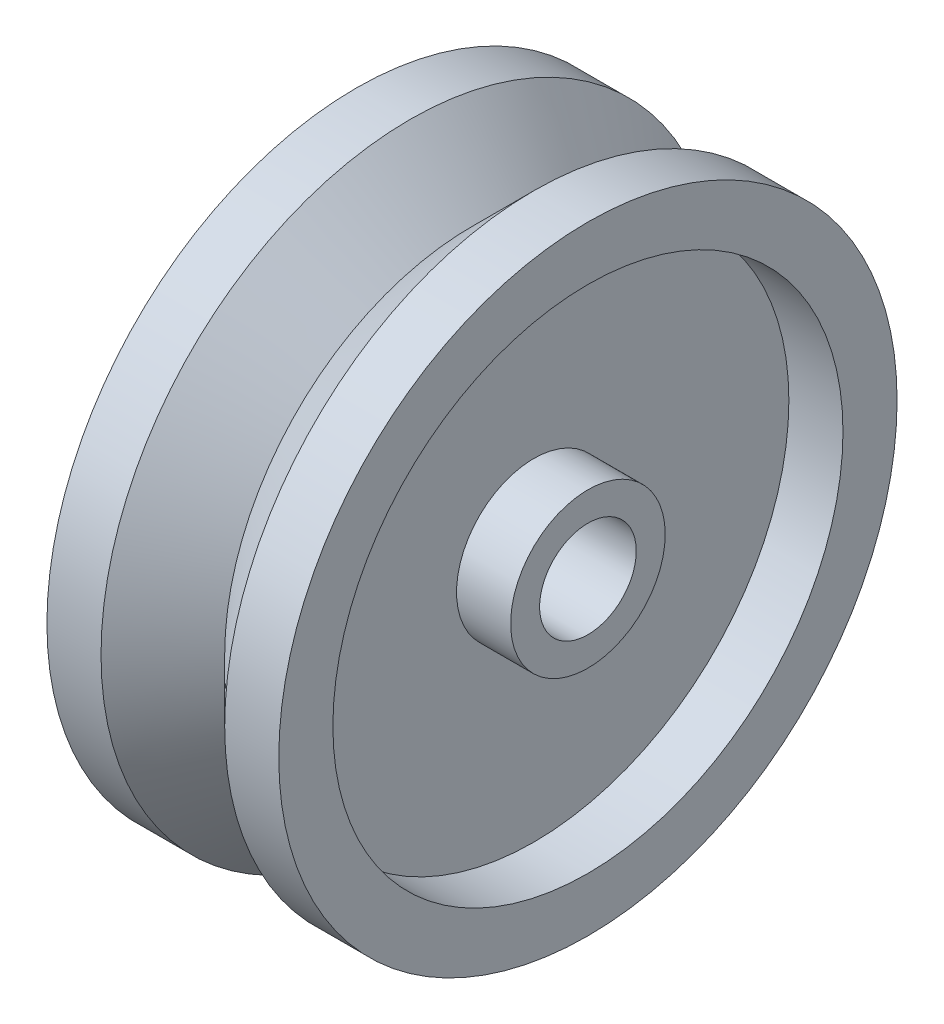
ISO-10303-21;
HEADER;
FILE_DESCRIPTION(('STEP AP214'),'2;1');
FILE_NAME('part.step','',(''),(''),'','','');
FILE_SCHEMA(('AUTOMOTIVE_DESIGN { 1 0 10303 214 1 1 1 1 }'));
ENDSEC;
DATA;
#1=APPLICATION_CONTEXT('core data for automotive mechanical design processes');
#2=APPLICATION_PROTOCOL_DEFINITION('international standard','automotive_design',2000,#1);
#3=PRODUCT_CONTEXT('',#1,'mechanical');
#4=PRODUCT('Part','Part','',(#3));
#5=PRODUCT_RELATED_PRODUCT_CATEGORY('part','',(#4));
#6=PRODUCT_DEFINITION_FORMATION('','',#4);
#7=PRODUCT_DEFINITION_CONTEXT('part definition',#1,'design');
#8=PRODUCT_DEFINITION('design','',#6,#7);
#9=PRODUCT_DEFINITION_SHAPE('','',#8);
#10=(LENGTH_UNIT() NAMED_UNIT(*) SI_UNIT(.MILLI.,.METRE.));
#11=(NAMED_UNIT(*) PLANE_ANGLE_UNIT() SI_UNIT($,.RADIAN.));
#12=(NAMED_UNIT(*) SI_UNIT($,.STERADIAN.) SOLID_ANGLE_UNIT());
#13=UNCERTAINTY_MEASURE_WITH_UNIT(LENGTH_MEASURE(1.E-05),#10,'distance_accuracy_value','');
#14=(GEOMETRIC_REPRESENTATION_CONTEXT(3) GLOBAL_UNCERTAINTY_ASSIGNED_CONTEXT((#13)) GLOBAL_UNIT_ASSIGNED_CONTEXT((#10,
#11,#12)) REPRESENTATION_CONTEXT('',''));
#15=CARTESIAN_POINT('',(0.,0.,0.));
#16=DIRECTION('',(0.,0.,1.));
#17=DIRECTION('',(1.,0.,0.));
#18=AXIS2_PLACEMENT_3D('',#15,#16,#17);
#19=CARTESIAN_POINT('',(15.,0.,0.));
#20=DIRECTION('',(-1.,0.,0.));
#21=DIRECTION('',(0.,0.,1.));
#22=AXIS2_PLACEMENT_3D('',#19,#20,#21);
#23=CYLINDRICAL_SURFACE('',#22,20.);
#24=CARTESIAN_POINT('',(0.,0.,0.));
#25=DIRECTION('',(1.,0.,0.));
#26=DIRECTION('',(0.,0.,-1.));
#27=AXIS2_PLACEMENT_3D('',#24,#25,#26);
#28=CIRCLE('',#27,20.);
#29=CARTESIAN_POINT('',(0.,0.,-20.));
#30=VERTEX_POINT('',#29);
#31=EDGE_CURVE('E34',#30,#30,#28,.T.);
#32=ORIENTED_EDGE('',*,*,#31,.T.);
#33=EDGE_LOOP('',(#32));
#34=FACE_BOUND('',#33,.T.);
#35=CARTESIAN_POINT('',(3.5,0.,0.));
#36=DIRECTION('',(-1.,0.,0.));
#37=DIRECTION('',(0.,0.,1.));
#38=AXIS2_PLACEMENT_3D('',#35,#36,#37);
#39=CIRCLE('',#38,20.);
#40=CARTESIAN_POINT('',(3.5,0.,20.));
#41=VERTEX_POINT('',#40);
#42=EDGE_CURVE('E70',#41,#41,#39,.T.);
#43=ORIENTED_EDGE('',*,*,#42,.T.);
#44=EDGE_LOOP('',(#43));
#45=FACE_BOUND('',#44,.T.);
#46=ADVANCED_FACE('F31',(#34,#45),#23,.T.);
#47=CARTESIAN_POINT('',(15.,0.,0.));
#48=DIRECTION('',(1.,0.,0.));
#49=DIRECTION('',(0.,0.,-1.));
#50=AXIS2_PLACEMENT_3D('',#47,#48,#49);
#51=CIRCLE('',#50,20.);
#52=CARTESIAN_POINT('',(15.,0.,-20.));
#53=VERTEX_POINT('',#52);
#54=EDGE_CURVE('E10',#53,#53,#51,.T.);
#55=ORIENTED_EDGE('',*,*,#54,.F.);
#56=EDGE_LOOP('',(#55));
#57=FACE_BOUND('',#56,.T.);
#58=CARTESIAN_POINT('',(11.5,0.,0.));
#59=DIRECTION('',(-1.,0.,0.));
#60=DIRECTION('',(0.,0.,1.));
#61=AXIS2_PLACEMENT_3D('',#58,#59,#60);
#62=CIRCLE('',#61,20.);
#63=CARTESIAN_POINT('',(11.5,0.,20.));
#64=VERTEX_POINT('',#63);
#65=EDGE_CURVE('E78',#64,#64,#62,.T.);
#66=ORIENTED_EDGE('',*,*,#65,.F.);
#67=EDGE_LOOP('',(#66));
#68=FACE_BOUND('',#67,.T.);
#69=ADVANCED_FACE('F85',(#57,#68),#23,.T.);
#70=CARTESIAN_POINT('',(15.,0.,0.));
#71=DIRECTION('',(1.,0.,0.));
#72=DIRECTION('',(0.,0.,-1.));
#73=AXIS2_PLACEMENT_3D('',#70,#71,#72);
#74=PLANE('',#73);
#75=CARTESIAN_POINT('',(15.,0.,0.));
#76=DIRECTION('',(1.,0.,0.));
#77=DIRECTION('',(0.,0.,-1.));
#78=AXIS2_PLACEMENT_3D('',#75,#76,#77);
#79=CIRCLE('',#78,16.5);
#80=CARTESIAN_POINT('',(15.,0.,-16.5));
#81=VERTEX_POINT('',#80);
#82=EDGE_CURVE('E43',#81,#81,#79,.T.);
#83=ORIENTED_EDGE('',*,*,#82,.F.);
#84=EDGE_LOOP('',(#83));
#85=FACE_BOUND('',#84,.T.);
#86=ORIENTED_EDGE('',*,*,#54,.T.);
#87=EDGE_LOOP('',(#86));
#88=FACE_BOUND('',#87,.T.);
#89=ADVANCED_FACE('F87',(#85,#88),#74,.T.);
#90=CARTESIAN_POINT('',(0.,0.,0.));
#91=DIRECTION('',(1.,0.,0.));
#92=DIRECTION('',(0.,0.,-1.));
#93=AXIS2_PLACEMENT_3D('',#90,#91,#92);
#94=PLANE('',#93);
#95=CARTESIAN_POINT('',(0.,0.,0.));
#96=DIRECTION('',(-1.,0.,0.));
#97=DIRECTION('',(0.,0.,1.));
#98=AXIS2_PLACEMENT_3D('',#95,#96,#97);
#99=CIRCLE('',#98,16.5);
#100=CARTESIAN_POINT('',(0.,0.,16.5));
#101=VERTEX_POINT('',#100);
#102=EDGE_CURVE('E55',#101,#101,#99,.T.);
#103=ORIENTED_EDGE('',*,*,#102,.F.);
#104=EDGE_LOOP('',(#103));
#105=FACE_BOUND('',#104,.T.);
#106=ORIENTED_EDGE('',*,*,#31,.F.);
#107=EDGE_LOOP('',(#106));
#108=FACE_BOUND('',#107,.T.);
#109=ADVANCED_FACE('F93',(#105,#108),#94,.F.);
#110=CARTESIAN_POINT('',(11.5,0.,0.));
#111=DIRECTION('',(1.,0.,0.));
#112=DIRECTION('',(0.,0.,-1.));
#113=AXIS2_PLACEMENT_3D('',#110,#111,#112);
#114=CYLINDRICAL_SURFACE('',#113,16.5);
#115=CARTESIAN_POINT('',(11.5,0.,0.));
#116=DIRECTION('',(1.,0.,0.));
#117=DIRECTION('',(0.,0.,-1.));
#118=AXIS2_PLACEMENT_3D('',#115,#116,#117);
#119=CIRCLE('',#118,16.5);
#120=CARTESIAN_POINT('',(11.5,0.,-16.5));
#121=VERTEX_POINT('',#120);
#122=EDGE_CURVE('E41',#121,#121,#119,.T.);
#123=ORIENTED_EDGE('',*,*,#122,.F.);
#124=EDGE_LOOP('',(#123));
#125=FACE_BOUND('',#124,.T.);
#126=ORIENTED_EDGE('',*,*,#82,.T.);
#127=EDGE_LOOP('',(#126));
#128=FACE_BOUND('',#127,.T.);
#129=ADVANCED_FACE('F137',(#125,#128),#114,.F.);
#130=CARTESIAN_POINT('',(11.5,0.,0.));
#131=DIRECTION('',(1.,0.,0.));
#132=DIRECTION('',(0.,0.,-1.));
#133=AXIS2_PLACEMENT_3D('',#130,#131,#132);
#134=PLANE('',#133);
#135=CARTESIAN_POINT('',(11.5,0.,0.));
#136=DIRECTION('',(1.,0.,0.));
#137=DIRECTION('',(0.,0.,-1.));
#138=AXIS2_PLACEMENT_3D('',#135,#136,#137);
#139=CIRCLE('',#138,5.);
#140=CARTESIAN_POINT('',(11.5,0.,-5.));
#141=VERTEX_POINT('',#140);
#142=EDGE_CURVE('E46',#141,#141,#139,.T.);
#143=ORIENTED_EDGE('',*,*,#142,.F.);
#144=EDGE_LOOP('',(#143));
#145=FACE_BOUND('',#144,.T.);
#146=ORIENTED_EDGE('',*,*,#122,.T.);
#147=EDGE_LOOP('',(#146));
#148=FACE_BOUND('',#147,.T.);
#149=ADVANCED_FACE('F133',(#145,#148),#134,.T.);
#150=CARTESIAN_POINT('',(11.5,0.,0.));
#151=DIRECTION('',(1.,0.,0.));
#152=DIRECTION('',(0.,0.,-1.));
#153=AXIS2_PLACEMENT_3D('',#150,#151,#152);
#154=CYLINDRICAL_SURFACE('',#153,5.);
#155=ORIENTED_EDGE('',*,*,#142,.T.);
#156=EDGE_LOOP('',(#155));
#157=FACE_BOUND('',#156,.T.);
#158=CARTESIAN_POINT('',(15.,0.,0.));
#159=DIRECTION('',(1.,0.,0.));
#160=DIRECTION('',(0.,0.,-1.));
#161=AXIS2_PLACEMENT_3D('',#158,#159,#160);
#162=CIRCLE('',#161,5.);
#163=CARTESIAN_POINT('',(15.,0.,-5.));
#164=VERTEX_POINT('',#163);
#165=EDGE_CURVE('E49',#164,#164,#162,.T.);
#166=ORIENTED_EDGE('',*,*,#165,.F.);
#167=EDGE_LOOP('',(#166));
#168=FACE_BOUND('',#167,.T.);
#169=ADVANCED_FACE('F130',(#157,#168),#154,.T.);
#170=CARTESIAN_POINT('',(15.,0.,0.));
#171=DIRECTION('',(1.,0.,0.));
#172=DIRECTION('',(0.,0.,-1.));
#173=AXIS2_PLACEMENT_3D('',#170,#171,#172);
#174=CIRCLE('',#173,3.125);
#175=CARTESIAN_POINT('',(15.,0.,-3.125));
#176=VERTEX_POINT('',#175);
#177=EDGE_CURVE('E67',#176,#176,#174,.T.);
#178=ORIENTED_EDGE('',*,*,#177,.F.);
#179=EDGE_LOOP('',(#178));
#180=FACE_BOUND('',#179,.T.);
#181=ORIENTED_EDGE('',*,*,#165,.T.);
#182=EDGE_LOOP('',(#181));
#183=FACE_BOUND('',#182,.T.);
#184=ADVANCED_FACE('F96',(#180,#183),#74,.T.);
#185=CARTESIAN_POINT('',(3.5,0.,0.));
#186=DIRECTION('',(-1.,0.,0.));
#187=DIRECTION('',(0.,0.,1.));
#188=AXIS2_PLACEMENT_3D('',#185,#186,#187);
#189=CYLINDRICAL_SURFACE('',#188,16.5);
#190=CARTESIAN_POINT('',(3.5,0.,0.));
#191=DIRECTION('',(-1.,0.,0.));
#192=DIRECTION('',(0.,0.,1.));
#193=AXIS2_PLACEMENT_3D('',#190,#191,#192);
#194=CIRCLE('',#193,16.5);
#195=CARTESIAN_POINT('',(3.5,0.,16.5));
#196=VERTEX_POINT('',#195);
#197=EDGE_CURVE('E52',#196,#196,#194,.T.);
#198=ORIENTED_EDGE('',*,*,#197,.F.);
#199=EDGE_LOOP('',(#198));
#200=FACE_BOUND('',#199,.T.);
#201=ORIENTED_EDGE('',*,*,#102,.T.);
#202=EDGE_LOOP('',(#201));
#203=FACE_BOUND('',#202,.T.);
#204=ADVANCED_FACE('F125',(#200,#203),#189,.F.);
#205=CARTESIAN_POINT('',(3.5,0.,0.));
#206=DIRECTION('',(-1.,0.,0.));
#207=DIRECTION('',(0.,0.,1.));
#208=AXIS2_PLACEMENT_3D('',#205,#206,#207);
#209=PLANE('',#208);
#210=CARTESIAN_POINT('',(3.5,0.,0.));
#211=DIRECTION('',(-1.,0.,0.));
#212=DIRECTION('',(0.,0.,1.));
#213=AXIS2_PLACEMENT_3D('',#210,#211,#212);
#214=CIRCLE('',#213,5.);
#215=CARTESIAN_POINT('',(3.5,0.,5.));
#216=VERTEX_POINT('',#215);
#217=EDGE_CURVE('E58',#216,#216,#214,.T.);
#218=ORIENTED_EDGE('',*,*,#217,.F.);
#219=EDGE_LOOP('',(#218));
#220=FACE_BOUND('',#219,.T.);
#221=ORIENTED_EDGE('',*,*,#197,.T.);
#222=EDGE_LOOP('',(#221));
#223=FACE_BOUND('',#222,.T.);
#224=ADVANCED_FACE('F121',(#220,#223),#209,.T.);
#225=CARTESIAN_POINT('',(3.5,0.,0.));
#226=DIRECTION('',(-1.,0.,0.));
#227=DIRECTION('',(0.,0.,1.));
#228=AXIS2_PLACEMENT_3D('',#225,#226,#227);
#229=CYLINDRICAL_SURFACE('',#228,5.);
#230=ORIENTED_EDGE('',*,*,#217,.T.);
#231=EDGE_LOOP('',(#230));
#232=FACE_BOUND('',#231,.T.);
#233=CARTESIAN_POINT('',(0.,0.,0.));
#234=DIRECTION('',(-1.,0.,0.));
#235=DIRECTION('',(0.,0.,1.));
#236=AXIS2_PLACEMENT_3D('',#233,#234,#235);
#237=CIRCLE('',#236,5.);
#238=CARTESIAN_POINT('',(0.,0.,5.));
#239=VERTEX_POINT('',#238);
#240=EDGE_CURVE('E61',#239,#239,#237,.T.);
#241=ORIENTED_EDGE('',*,*,#240,.F.);
#242=EDGE_LOOP('',(#241));
#243=FACE_BOUND('',#242,.T.);
#244=ADVANCED_FACE('F118',(#232,#243),#229,.T.);
#245=CARTESIAN_POINT('',(0.,0.,0.));
#246=DIRECTION('',(1.,0.,0.));
#247=DIRECTION('',(0.,0.,-1.));
#248=AXIS2_PLACEMENT_3D('',#245,#246,#247);
#249=CIRCLE('',#248,3.125);
#250=CARTESIAN_POINT('',(0.,0.,-3.125));
#251=VERTEX_POINT('',#250);
#252=EDGE_CURVE('E64',#251,#251,#249,.T.);
#253=ORIENTED_EDGE('',*,*,#252,.T.);
#254=EDGE_LOOP('',(#253));
#255=FACE_BOUND('',#254,.T.);
#256=ORIENTED_EDGE('',*,*,#240,.T.);
#257=EDGE_LOOP('',(#256));
#258=FACE_BOUND('',#257,.T.);
#259=ADVANCED_FACE('F114',(#255,#258),#94,.F.);
#260=CARTESIAN_POINT('',(0.,0.,0.));
#261=DIRECTION('',(1.,0.,0.));
#262=DIRECTION('',(0.,0.,-1.));
#263=AXIS2_PLACEMENT_3D('',#260,#261,#262);
#264=CYLINDRICAL_SURFACE('',#263,3.125);
#265=ORIENTED_EDGE('',*,*,#252,.F.);
#266=EDGE_LOOP('',(#265));
#267=FACE_BOUND('',#266,.T.);
#268=ORIENTED_EDGE('',*,*,#177,.T.);
#269=EDGE_LOOP('',(#268));
#270=FACE_BOUND('',#269,.T.);
#271=ADVANCED_FACE('F106',(#267,#270),#264,.F.);
#272=CARTESIAN_POINT('',(3.5,0.,0.));
#273=DIRECTION('',(-1.,0.,0.));
#274=DIRECTION('',(0.,0.,1.));
#275=AXIS2_PLACEMENT_3D('',#272,#273,#274);
#276=CONICAL_SURFACE('',#275,20.,0.785398163397448);
#277=CARTESIAN_POINT('',(7.5,0.,0.));
#278=DIRECTION('',(-1.,0.,0.));
#279=DIRECTION('',(0.,0.,1.));
#280=AXIS2_PLACEMENT_3D('',#277,#278,#279);
#281=CIRCLE('',#280,16.);
#282=CARTESIAN_POINT('',(7.5,0.,16.));
#283=VERTEX_POINT('',#282);
#284=EDGE_CURVE('E75',#283,#283,#281,.T.);
#285=ORIENTED_EDGE('',*,*,#284,.T.);
#286=EDGE_LOOP('',(#285));
#287=FACE_BOUND('',#286,.T.);
#288=ORIENTED_EDGE('',*,*,#42,.F.);
#289=EDGE_LOOP('',(#288));
#290=FACE_BOUND('',#289,.T.);
#291=ADVANCED_FACE('F104',(#287,#290),#276,.T.);
#292=CARTESIAN_POINT('',(7.5,0.,0.));
#293=DIRECTION('',(1.,0.,0.));
#294=DIRECTION('',(0.,0.,-1.));
#295=AXIS2_PLACEMENT_3D('',#292,#293,#294);
#296=CONICAL_SURFACE('',#295,16.,0.785398163397448);
#297=ORIENTED_EDGE('',*,*,#65,.T.);
#298=EDGE_LOOP('',(#297));
#299=FACE_BOUND('',#298,.T.);
#300=ORIENTED_EDGE('',*,*,#284,.F.);
#301=EDGE_LOOP('',(#300));
#302=FACE_BOUND('',#301,.T.);
#303=ADVANCED_FACE('F82',(#299,#302),#296,.T.);
#304=CLOSED_SHELL('',(#46,#69,#89,#109,#129,#149,#169,#184,#204,#224,#244,#259,#271,#291,#303));
#305=MANIFOLD_SOLID_BREP('B2',#304);
#306=ADVANCED_BREP_SHAPE_REPRESENTATION('',(#18,#305),#14);
#307=SHAPE_DEFINITION_REPRESENTATION(#9,#306);
ENDSEC;
END-ISO-10303-21;
